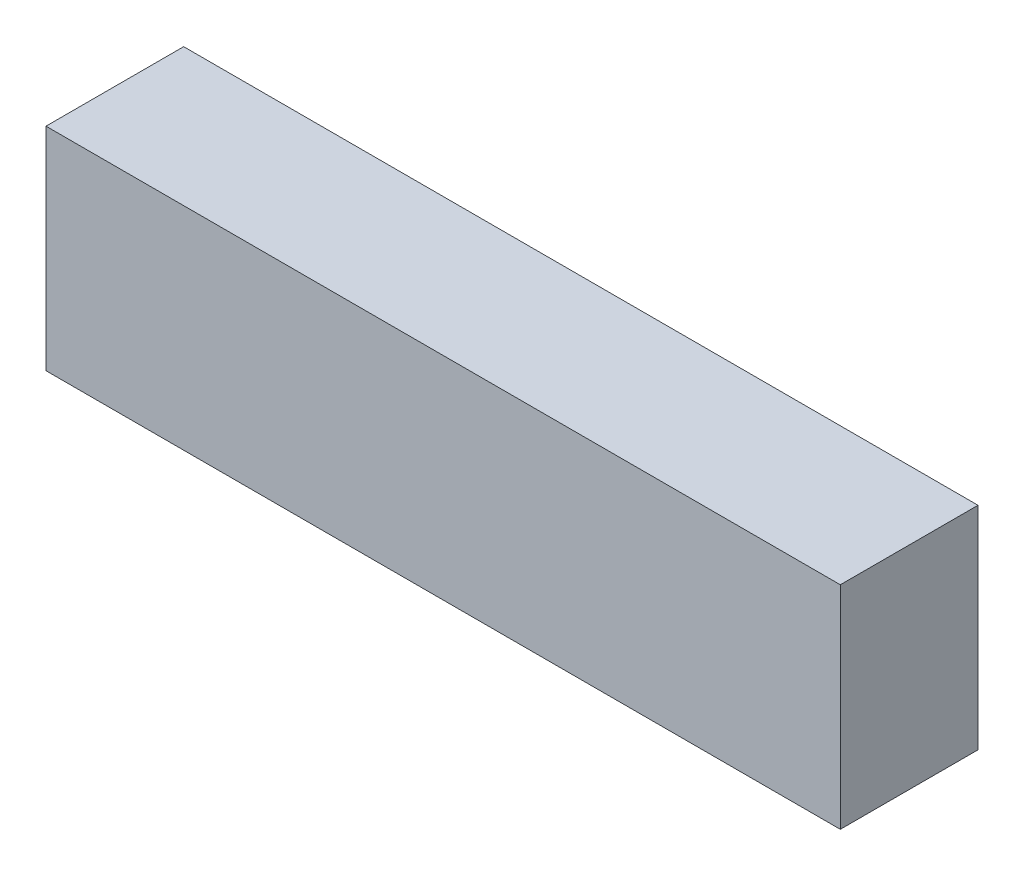
ISO-10303-21;
HEADER;
FILE_DESCRIPTION(('STEP AP214'),'2;1');
FILE_NAME('part.step','',(''),(''),'','','');
FILE_SCHEMA(('AUTOMOTIVE_DESIGN { 1 0 10303 214 1 1 1 1 }'));
ENDSEC;
DATA;
#1=APPLICATION_CONTEXT('core data for automotive mechanical design processes');
#2=APPLICATION_PROTOCOL_DEFINITION('international standard','automotive_design',2000,#1);
#3=PRODUCT_CONTEXT('',#1,'mechanical');
#4=PRODUCT('Part','Part','',(#3));
#5=PRODUCT_RELATED_PRODUCT_CATEGORY('part','',(#4));
#6=PRODUCT_DEFINITION_FORMATION('','',#4);
#7=PRODUCT_DEFINITION_CONTEXT('part definition',#1,'design');
#8=PRODUCT_DEFINITION('design','',#6,#7);
#9=PRODUCT_DEFINITION_SHAPE('','',#8);
#10=(LENGTH_UNIT() NAMED_UNIT(*) SI_UNIT(.MILLI.,.METRE.));
#11=(NAMED_UNIT(*) PLANE_ANGLE_UNIT() SI_UNIT($,.RADIAN.));
#12=(NAMED_UNIT(*) SI_UNIT($,.STERADIAN.) SOLID_ANGLE_UNIT());
#13=UNCERTAINTY_MEASURE_WITH_UNIT(LENGTH_MEASURE(1.E-05),#10,'distance_accuracy_value','');
#14=(GEOMETRIC_REPRESENTATION_CONTEXT(3) GLOBAL_UNCERTAINTY_ASSIGNED_CONTEXT((#13)) GLOBAL_UNIT_ASSIGNED_CONTEXT((#10,
#11,#12)) REPRESENTATION_CONTEXT('',''));
#15=CARTESIAN_POINT('',(0.,0.,0.));
#16=DIRECTION('',(0.,0.,1.));
#17=DIRECTION('',(1.,0.,0.));
#18=AXIS2_PLACEMENT_3D('',#15,#16,#17);
#19=CARTESIAN_POINT('',(37.5,-10.,13.));
#20=DIRECTION('',(-1.,0.,0.));
#21=DIRECTION('',(0.,0.,1.));
#22=AXIS2_PLACEMENT_3D('',#19,#20,#21);
#23=PLANE('',#22);
#24=DIRECTION('',(0.,1.,0.));
#25=VECTOR('',#24,1.);
#26=CARTESIAN_POINT('',(37.5,-10.,0.));
#27=LINE('',#26,#25);
#28=CARTESIAN_POINT('',(37.5,-10.,0.));
#29=VERTEX_POINT('',#28);
#30=CARTESIAN_POINT('',(37.5,10.,0.));
#31=VERTEX_POINT('',#30);
#32=EDGE_CURVE('E96',#29,#31,#27,.T.);
#33=ORIENTED_EDGE('',*,*,#32,.T.);
#34=DIRECTION('',(0.,0.,-1.));
#35=VECTOR('',#34,1.);
#36=CARTESIAN_POINT('',(37.5,10.,13.));
#37=LINE('',#36,#35);
#38=CARTESIAN_POINT('',(37.5,10.,13.));
#39=VERTEX_POINT('',#38);
#40=EDGE_CURVE('E11',#39,#31,#37,.T.);
#41=ORIENTED_EDGE('',*,*,#40,.F.);
#42=DIRECTION('',(0.,1.,0.));
#43=VECTOR('',#42,1.);
#44=CARTESIAN_POINT('',(37.5,-10.,13.));
#45=LINE('',#44,#43);
#46=CARTESIAN_POINT('',(37.5,-10.,13.));
#47=VERTEX_POINT('',#46);
#48=EDGE_CURVE('E84',#47,#39,#45,.T.);
#49=ORIENTED_EDGE('',*,*,#48,.F.);
#50=DIRECTION('',(0.,0.,-1.));
#51=VECTOR('',#50,1.);
#52=CARTESIAN_POINT('',(37.5,-10.,13.));
#53=LINE('',#52,#51);
#54=EDGE_CURVE('E92',#47,#29,#53,.T.);
#55=ORIENTED_EDGE('',*,*,#54,.T.);
#56=EDGE_LOOP('',(#33,#41,#49,#55));
#57=FACE_BOUND('',#56,.T.);
#58=ADVANCED_FACE('F33',(#57),#23,.F.);
#59=CARTESIAN_POINT('',(-37.5,10.,13.));
#60=DIRECTION('',(0.,-1.,0.));
#61=DIRECTION('',(0.,0.,-1.));
#62=AXIS2_PLACEMENT_3D('',#59,#60,#61);
#63=PLANE('',#62);
#64=DIRECTION('',(-1.,0.,0.));
#65=VECTOR('',#64,1.);
#66=CARTESIAN_POINT('',(-37.5,10.,0.));
#67=LINE('',#66,#65);
#68=CARTESIAN_POINT('',(-37.5,10.,0.));
#69=VERTEX_POINT('',#68);
#70=EDGE_CURVE('E88',#31,#69,#67,.T.);
#71=ORIENTED_EDGE('',*,*,#70,.T.);
#72=DIRECTION('',(0.,0.,-1.));
#73=VECTOR('',#72,1.);
#74=CARTESIAN_POINT('',(-37.5,10.,13.));
#75=LINE('',#74,#73);
#76=CARTESIAN_POINT('',(-37.5,10.,13.));
#77=VERTEX_POINT('',#76);
#78=EDGE_CURVE('E41',#77,#69,#75,.T.);
#79=ORIENTED_EDGE('',*,*,#78,.F.);
#80=DIRECTION('',(-1.,0.,0.));
#81=VECTOR('',#80,1.);
#82=CARTESIAN_POINT('',(-37.5,10.,13.));
#83=LINE('',#82,#81);
#84=EDGE_CURVE('E79',#39,#77,#83,.T.);
#85=ORIENTED_EDGE('',*,*,#84,.F.);
#86=ORIENTED_EDGE('',*,*,#40,.T.);
#87=EDGE_LOOP('',(#71,#79,#85,#86));
#88=FACE_BOUND('',#87,.T.);
#89=ADVANCED_FACE('F87',(#88),#63,.F.);
#90=CARTESIAN_POINT('',(-37.5,-10.,13.));
#91=DIRECTION('',(1.,0.,0.));
#92=DIRECTION('',(0.,0.,-1.));
#93=AXIS2_PLACEMENT_3D('',#90,#91,#92);
#94=PLANE('',#93);
#95=DIRECTION('',(0.,-1.,0.));
#96=VECTOR('',#95,1.);
#97=CARTESIAN_POINT('',(-37.5,-10.,0.));
#98=LINE('',#97,#96);
#99=CARTESIAN_POINT('',(-37.5,-10.,0.));
#100=VERTEX_POINT('',#99);
#101=EDGE_CURVE('E66',#69,#100,#98,.T.);
#102=ORIENTED_EDGE('',*,*,#101,.T.);
#103=DIRECTION('',(0.,0.,-1.));
#104=VECTOR('',#103,1.);
#105=CARTESIAN_POINT('',(-37.5,-10.,13.));
#106=LINE('',#105,#104);
#107=CARTESIAN_POINT('',(-37.5,-10.,13.));
#108=VERTEX_POINT('',#107);
#109=EDGE_CURVE('E89',#108,#100,#106,.T.);
#110=ORIENTED_EDGE('',*,*,#109,.F.);
#111=DIRECTION('',(0.,-1.,0.));
#112=VECTOR('',#111,1.);
#113=CARTESIAN_POINT('',(-37.5,-10.,13.));
#114=LINE('',#113,#112);
#115=EDGE_CURVE('E82',#77,#108,#114,.T.);
#116=ORIENTED_EDGE('',*,*,#115,.F.);
#117=ORIENTED_EDGE('',*,*,#78,.T.);
#118=EDGE_LOOP('',(#102,#110,#116,#117));
#119=FACE_BOUND('',#118,.T.);
#120=ADVANCED_FACE('F90',(#119),#94,.F.);
#121=CARTESIAN_POINT('',(-37.5,-10.,13.));
#122=DIRECTION('',(0.,1.,0.));
#123=DIRECTION('',(0.,0.,1.));
#124=AXIS2_PLACEMENT_3D('',#121,#122,#123);
#125=PLANE('',#124);
#126=DIRECTION('',(1.,0.,0.));
#127=VECTOR('',#126,1.);
#128=CARTESIAN_POINT('',(-37.5,-10.,0.));
#129=LINE('',#128,#127);
#130=EDGE_CURVE('E72',#100,#29,#129,.T.);
#131=ORIENTED_EDGE('',*,*,#130,.T.);
#132=ORIENTED_EDGE('',*,*,#54,.F.);
#133=DIRECTION('',(1.,0.,0.));
#134=VECTOR('',#133,1.);
#135=CARTESIAN_POINT('',(-37.5,-10.,13.));
#136=LINE('',#135,#134);
#137=EDGE_CURVE('E49',#108,#47,#136,.T.);
#138=ORIENTED_EDGE('',*,*,#137,.F.);
#139=ORIENTED_EDGE('',*,*,#109,.T.);
#140=EDGE_LOOP('',(#131,#132,#138,#139));
#141=FACE_BOUND('',#140,.T.);
#142=ADVANCED_FACE('F103',(#141),#125,.F.);
#143=CARTESIAN_POINT('',(0.,0.,13.));
#144=DIRECTION('',(0.,0.,-1.));
#145=DIRECTION('',(-1.,0.,0.));
#146=AXIS2_PLACEMENT_3D('',#143,#144,#145);
#147=PLANE('',#146);
#148=ORIENTED_EDGE('',*,*,#48,.T.);
#149=ORIENTED_EDGE('',*,*,#84,.T.);
#150=ORIENTED_EDGE('',*,*,#115,.T.);
#151=ORIENTED_EDGE('',*,*,#137,.T.);
#152=EDGE_LOOP('',(#148,#149,#150,#151));
#153=FACE_BOUND('',#152,.T.);
#154=ADVANCED_FACE('F80',(#153),#147,.F.);
#155=CARTESIAN_POINT('',(0.,0.,0.));
#156=DIRECTION('',(0.,0.,-1.));
#157=DIRECTION('',(-1.,0.,0.));
#158=AXIS2_PLACEMENT_3D('',#155,#156,#157);
#159=PLANE('',#158);
#160=ORIENTED_EDGE('',*,*,#32,.F.);
#161=ORIENTED_EDGE('',*,*,#130,.F.);
#162=ORIENTED_EDGE('',*,*,#101,.F.);
#163=ORIENTED_EDGE('',*,*,#70,.F.);
#164=EDGE_LOOP('',(#160,#161,#162,#163));
#165=FACE_BOUND('',#164,.T.);
#166=ADVANCED_FACE('F106',(#165),#159,.T.);
#167=CLOSED_SHELL('',(#58,#89,#120,#142,#154,#166));
#168=MANIFOLD_SOLID_BREP('B2',#167);
#169=ADVANCED_BREP_SHAPE_REPRESENTATION('',(#18,#168),#14);
#170=SHAPE_DEFINITION_REPRESENTATION(#9,#169);
ENDSEC;
END-ISO-10303-21;
